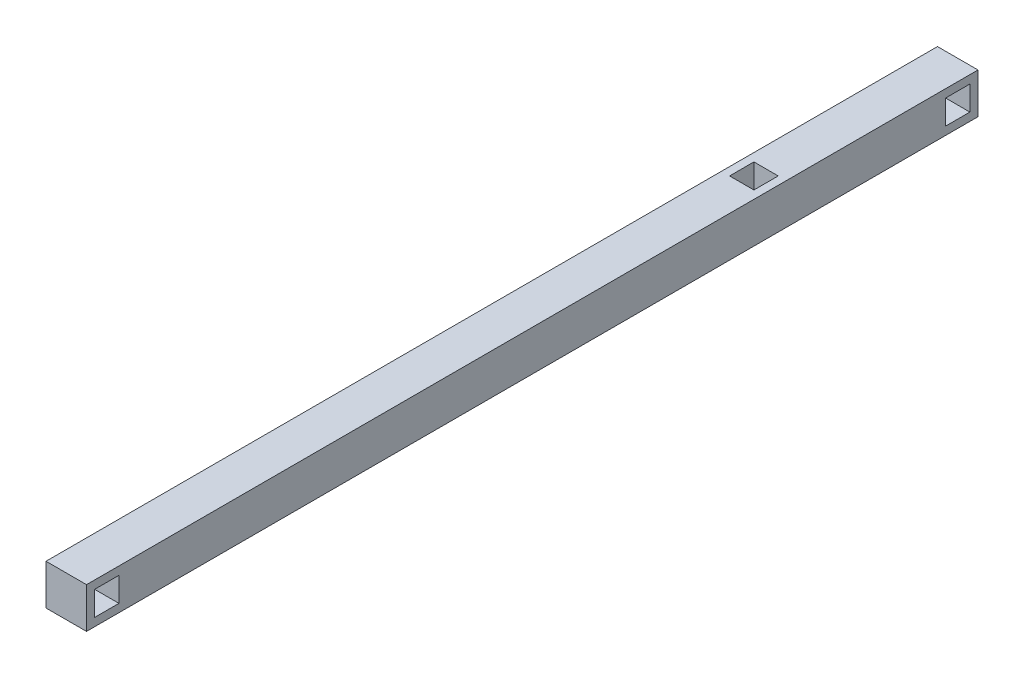
ISO-10303-21;
HEADER;
FILE_DESCRIPTION(('STEP AP214'),'2;1');
FILE_NAME('part.step','',(''),(''),'','','');
FILE_SCHEMA(('AUTOMOTIVE_DESIGN { 1 0 10303 214 1 1 1 1 }'));
ENDSEC;
DATA;
#1=APPLICATION_CONTEXT('core data for automotive mechanical design processes');
#2=APPLICATION_PROTOCOL_DEFINITION('international standard','automotive_design',2000,#1);
#3=PRODUCT_CONTEXT('',#1,'mechanical');
#4=PRODUCT('Part','Part','',(#3));
#5=PRODUCT_RELATED_PRODUCT_CATEGORY('part','',(#4));
#6=PRODUCT_DEFINITION_FORMATION('','',#4);
#7=PRODUCT_DEFINITION_CONTEXT('part definition',#1,'design');
#8=PRODUCT_DEFINITION('design','',#6,#7);
#9=PRODUCT_DEFINITION_SHAPE('','',#8);
#10=(LENGTH_UNIT() NAMED_UNIT(*) SI_UNIT(.MILLI.,.METRE.));
#11=(NAMED_UNIT(*) PLANE_ANGLE_UNIT() SI_UNIT($,.RADIAN.));
#12=(NAMED_UNIT(*) SI_UNIT($,.STERADIAN.) SOLID_ANGLE_UNIT());
#13=UNCERTAINTY_MEASURE_WITH_UNIT(LENGTH_MEASURE(1.E-05),#10,'distance_accuracy_value','');
#14=(GEOMETRIC_REPRESENTATION_CONTEXT(3) GLOBAL_UNCERTAINTY_ASSIGNED_CONTEXT((#13)) GLOBAL_UNIT_ASSIGNED_CONTEXT((#10,
#11,#12)) REPRESENTATION_CONTEXT('',''));
#15=CARTESIAN_POINT('',(0.,0.,0.));
#16=DIRECTION('',(0.,0.,1.));
#17=DIRECTION('',(1.,0.,0.));
#18=AXIS2_PLACEMENT_3D('',#15,#16,#17);
#19=CARTESIAN_POINT('',(0.,0.,110.));
#20=DIRECTION('',(1.,0.,0.));
#21=DIRECTION('',(0.,0.,-1.));
#22=AXIS2_PLACEMENT_3D('',#19,#20,#21);
#23=PLANE('',#22);
#24=DIRECTION('',(0.,0.,1.));
#25=VECTOR('',#24,1.);
#26=CARTESIAN_POINT('',(0.,1.,1.));
#27=LINE('',#26,#25);
#28=CARTESIAN_POINT('',(0.,1.,1.));
#29=VERTEX_POINT('',#28);
#30=CARTESIAN_POINT('',(0.,1.,4.));
#31=VERTEX_POINT('',#30);
#32=EDGE_CURVE('E184',#29,#31,#27,.T.);
#33=ORIENTED_EDGE('',*,*,#32,.F.);
#34=DIRECTION('',(0.,-1.,0.));
#35=VECTOR('',#34,1.);
#36=CARTESIAN_POINT('',(0.,1.,1.));
#37=LINE('',#36,#35);
#38=CARTESIAN_POINT('',(0.,4.,1.));
#39=VERTEX_POINT('',#38);
#40=EDGE_CURVE('E182',#39,#29,#37,.T.);
#41=ORIENTED_EDGE('',*,*,#40,.F.);
#42=DIRECTION('',(0.,0.,-1.));
#43=VECTOR('',#42,1.);
#44=CARTESIAN_POINT('',(0.,4.,1.));
#45=LINE('',#44,#43);
#46=CARTESIAN_POINT('',(0.,4.,4.));
#47=VERTEX_POINT('',#46);
#48=EDGE_CURVE('E191',#47,#39,#45,.T.);
#49=ORIENTED_EDGE('',*,*,#48,.F.);
#50=DIRECTION('',(0.,1.,0.));
#51=VECTOR('',#50,1.);
#52=CARTESIAN_POINT('',(0.,1.,4.));
#53=LINE('',#52,#51);
#54=EDGE_CURVE('E188',#31,#47,#53,.T.);
#55=ORIENTED_EDGE('',*,*,#54,.F.);
#56=EDGE_LOOP('',(#33,#41,#49,#55));
#57=FACE_BOUND('',#56,.T.);
#58=DIRECTION('',(0.,0.,-1.));
#59=VECTOR('',#58,1.);
#60=CARTESIAN_POINT('',(0.,4.,109.));
#61=LINE('',#60,#59);
#62=CARTESIAN_POINT('',(0.,4.,109.));
#63=VERTEX_POINT('',#62);
#64=CARTESIAN_POINT('',(0.,4.,106.));
#65=VERTEX_POINT('',#64);
#66=EDGE_CURVE('E205',#63,#65,#61,.T.);
#67=ORIENTED_EDGE('',*,*,#66,.F.);
#68=DIRECTION('',(0.,1.,0.));
#69=VECTOR('',#68,1.);
#70=CARTESIAN_POINT('',(0.,4.,109.));
#71=LINE('',#70,#69);
#72=CARTESIAN_POINT('',(0.,1.,109.));
#73=VERTEX_POINT('',#72);
#74=EDGE_CURVE('E181',#73,#63,#71,.T.);
#75=ORIENTED_EDGE('',*,*,#74,.F.);
#76=DIRECTION('',(0.,0.,1.));
#77=VECTOR('',#76,1.);
#78=CARTESIAN_POINT('',(0.,1.,109.));
#79=LINE('',#78,#77);
#80=CARTESIAN_POINT('',(0.,1.,106.));
#81=VERTEX_POINT('',#80);
#82=EDGE_CURVE('E211',#81,#73,#79,.T.);
#83=ORIENTED_EDGE('',*,*,#82,.F.);
#84=DIRECTION('',(0.,-1.,0.));
#85=VECTOR('',#84,1.);
#86=CARTESIAN_POINT('',(0.,4.,106.));
#87=LINE('',#86,#85);
#88=EDGE_CURVE('E208',#65,#81,#87,.T.);
#89=ORIENTED_EDGE('',*,*,#88,.F.);
#90=EDGE_LOOP('',(#67,#75,#83,#89));
#91=FACE_BOUND('',#90,.T.);
#92=DIRECTION('',(0.,-1.,0.));
#93=VECTOR('',#92,1.);
#94=CARTESIAN_POINT('',(0.,0.,0.));
#95=LINE('',#94,#93);
#96=CARTESIAN_POINT('',(0.,5.,0.));
#97=VERTEX_POINT('',#96);
#98=CARTESIAN_POINT('',(0.,0.,0.));
#99=VERTEX_POINT('',#98);
#100=EDGE_CURVE('E197',#97,#99,#95,.T.);
#101=ORIENTED_EDGE('',*,*,#100,.T.);
#102=DIRECTION('',(0.,0.,-1.));
#103=VECTOR('',#102,1.);
#104=CARTESIAN_POINT('',(0.,0.,110.));
#105=LINE('',#104,#103);
#106=CARTESIAN_POINT('',(0.,0.,110.));
#107=VERTEX_POINT('',#106);
#108=EDGE_CURVE('E248',#107,#99,#105,.T.);
#109=ORIENTED_EDGE('',*,*,#108,.F.);
#110=DIRECTION('',(0.,-1.,0.));
#111=VECTOR('',#110,1.);
#112=CARTESIAN_POINT('',(0.,0.,110.));
#113=LINE('',#112,#111);
#114=CARTESIAN_POINT('',(0.,5.,110.));
#115=VERTEX_POINT('',#114);
#116=EDGE_CURVE('E222',#115,#107,#113,.T.);
#117=ORIENTED_EDGE('',*,*,#116,.F.);
#118=DIRECTION('',(0.,0.,-1.));
#119=VECTOR('',#118,1.);
#120=CARTESIAN_POINT('',(0.,5.,110.));
#121=LINE('',#120,#119);
#122=EDGE_CURVE('E232',#115,#97,#121,.T.);
#123=ORIENTED_EDGE('',*,*,#122,.T.);
#124=EDGE_LOOP('',(#101,#109,#117,#123));
#125=FACE_BOUND('',#124,.T.);
#126=ADVANCED_FACE('F32',(#57,#91,#125),#23,.F.);
#127=CARTESIAN_POINT('',(0.,0.,110.));
#128=DIRECTION('',(0.,1.,0.));
#129=DIRECTION('',(0.,0.,1.));
#130=AXIS2_PLACEMENT_3D('',#127,#128,#129);
#131=PLANE('',#130);
#132=DIRECTION('',(-1.,0.,0.));
#133=VECTOR('',#132,1.);
#134=CARTESIAN_POINT('',(0.,0.,23.65));
#135=LINE('',#134,#133);
#136=CARTESIAN_POINT('',(4.,0.,23.65));
#137=VERTEX_POINT('',#136);
#138=CARTESIAN_POINT('',(0.999999999999999,0.,23.65));
#139=VERTEX_POINT('',#138);
#140=EDGE_CURVE('E175',#137,#139,#135,.T.);
#141=ORIENTED_EDGE('',*,*,#140,.T.);
#142=DIRECTION('',(0.,0.,1.));
#143=VECTOR('',#142,1.);
#144=CARTESIAN_POINT('',(1.00000000000001,0.,110.));
#145=LINE('',#144,#143);
#146=CARTESIAN_POINT('',(0.999999999999999,0.,26.65));
#147=VERTEX_POINT('',#146);
#148=EDGE_CURVE('E178',#139,#147,#145,.T.);
#149=ORIENTED_EDGE('',*,*,#148,.T.);
#150=DIRECTION('',(1.,0.,0.));
#151=VECTOR('',#150,1.);
#152=CARTESIAN_POINT('',(0.,0.,26.65));
#153=LINE('',#152,#151);
#154=CARTESIAN_POINT('',(4.,0.,26.65));
#155=VERTEX_POINT('',#154);
#156=EDGE_CURVE('E170',#147,#155,#153,.T.);
#157=ORIENTED_EDGE('',*,*,#156,.T.);
#158=DIRECTION('',(0.,0.,-1.));
#159=VECTOR('',#158,1.);
#160=CARTESIAN_POINT('',(4.00000000000005,0.,110.));
#161=LINE('',#160,#159);
#162=EDGE_CURVE('E150',#155,#137,#161,.T.);
#163=ORIENTED_EDGE('',*,*,#162,.T.);
#164=EDGE_LOOP('',(#141,#149,#157,#163));
#165=FACE_BOUND('',#164,.T.);
#166=DIRECTION('',(1.,0.,0.));
#167=VECTOR('',#166,1.);
#168=CARTESIAN_POINT('',(0.,0.,0.));
#169=LINE('',#168,#167);
#170=CARTESIAN_POINT('',(5.,0.,0.));
#171=VERTEX_POINT('',#170);
#172=EDGE_CURVE('E235',#99,#171,#169,.T.);
#173=ORIENTED_EDGE('',*,*,#172,.T.);
#174=DIRECTION('',(0.,0.,-1.));
#175=VECTOR('',#174,1.);
#176=CARTESIAN_POINT('',(5.,0.,110.));
#177=LINE('',#176,#175);
#178=CARTESIAN_POINT('',(5.,0.,110.));
#179=VERTEX_POINT('',#178);
#180=EDGE_CURVE('E245',#179,#171,#177,.T.);
#181=ORIENTED_EDGE('',*,*,#180,.F.);
#182=DIRECTION('',(1.,0.,0.));
#183=VECTOR('',#182,1.);
#184=CARTESIAN_POINT('',(0.,0.,110.));
#185=LINE('',#184,#183);
#186=EDGE_CURVE('E225',#107,#179,#185,.T.);
#187=ORIENTED_EDGE('',*,*,#186,.F.);
#188=ORIENTED_EDGE('',*,*,#108,.T.);
#189=EDGE_LOOP('',(#173,#181,#187,#188));
#190=FACE_BOUND('',#189,.T.);
#191=ADVANCED_FACE('F302',(#165,#190),#131,.F.);
#192=CARTESIAN_POINT('',(5.,0.,110.));
#193=DIRECTION('',(-1.,0.,0.));
#194=DIRECTION('',(0.,0.,1.));
#195=AXIS2_PLACEMENT_3D('',#192,#193,#194);
#196=PLANE('',#195);
#197=DIRECTION('',(0.,0.,-1.));
#198=VECTOR('',#197,1.);
#199=CARTESIAN_POINT('',(5.,4.,110.));
#200=LINE('',#199,#198);
#201=CARTESIAN_POINT('',(5.,4.,4.));
#202=VERTEX_POINT('',#201);
#203=CARTESIAN_POINT('',(5.,4.,1.));
#204=VERTEX_POINT('',#203);
#205=EDGE_CURVE('E39',#202,#204,#200,.T.);
#206=ORIENTED_EDGE('',*,*,#205,.T.);
#207=DIRECTION('',(0.,-1.,0.));
#208=VECTOR('',#207,1.);
#209=CARTESIAN_POINT('',(5.,0.,1.));
#210=LINE('',#209,#208);
#211=CARTESIAN_POINT('',(5.,1.,1.));
#212=VERTEX_POINT('',#211);
#213=EDGE_CURVE('E11',#204,#212,#210,.T.);
#214=ORIENTED_EDGE('',*,*,#213,.T.);
#215=DIRECTION('',(0.,0.,1.));
#216=VECTOR('',#215,1.);
#217=CARTESIAN_POINT('',(5.,1.,110.));
#218=LINE('',#217,#216);
#219=CARTESIAN_POINT('',(5.,1.,4.));
#220=VERTEX_POINT('',#219);
#221=EDGE_CURVE('E263',#212,#220,#218,.T.);
#222=ORIENTED_EDGE('',*,*,#221,.T.);
#223=DIRECTION('',(0.,1.,0.));
#224=VECTOR('',#223,1.);
#225=CARTESIAN_POINT('',(5.,0.,4.));
#226=LINE('',#225,#224);
#227=EDGE_CURVE('E266',#220,#202,#226,.T.);
#228=ORIENTED_EDGE('',*,*,#227,.T.);
#229=EDGE_LOOP('',(#206,#214,#222,#228));
#230=FACE_BOUND('',#229,.T.);
#231=DIRECTION('',(0.,0.,1.));
#232=VECTOR('',#231,1.);
#233=CARTESIAN_POINT('',(5.,1.,110.));
#234=LINE('',#233,#232);
#235=CARTESIAN_POINT('',(5.,1.,106.));
#236=VERTEX_POINT('',#235);
#237=CARTESIAN_POINT('',(5.,1.,109.));
#238=VERTEX_POINT('',#237);
#239=EDGE_CURVE('E257',#236,#238,#234,.T.);
#240=ORIENTED_EDGE('',*,*,#239,.T.);
#241=DIRECTION('',(0.,1.,0.));
#242=VECTOR('',#241,1.);
#243=CARTESIAN_POINT('',(5.,0.,109.));
#244=LINE('',#243,#242);
#245=CARTESIAN_POINT('',(5.,4.,109.));
#246=VERTEX_POINT('',#245);
#247=EDGE_CURVE('E260',#238,#246,#244,.T.);
#248=ORIENTED_EDGE('',*,*,#247,.T.);
#249=DIRECTION('',(0.,0.,-1.));
#250=VECTOR('',#249,1.);
#251=CARTESIAN_POINT('',(5.,4.,110.));
#252=LINE('',#251,#250);
#253=CARTESIAN_POINT('',(5.,4.,106.));
#254=VERTEX_POINT('',#253);
#255=EDGE_CURVE('E251',#246,#254,#252,.T.);
#256=ORIENTED_EDGE('',*,*,#255,.T.);
#257=DIRECTION('',(0.,-1.,0.));
#258=VECTOR('',#257,1.);
#259=CARTESIAN_POINT('',(5.,0.,106.));
#260=LINE('',#259,#258);
#261=EDGE_CURVE('E254',#254,#236,#260,.T.);
#262=ORIENTED_EDGE('',*,*,#261,.T.);
#263=EDGE_LOOP('',(#240,#248,#256,#262));
#264=FACE_BOUND('',#263,.T.);
#265=DIRECTION('',(0.,1.,0.));
#266=VECTOR('',#265,1.);
#267=CARTESIAN_POINT('',(5.,0.,0.));
#268=LINE('',#267,#266);
#269=CARTESIAN_POINT('',(5.,5.,0.));
#270=VERTEX_POINT('',#269);
#271=EDGE_CURVE('E237',#171,#270,#268,.T.);
#272=ORIENTED_EDGE('',*,*,#271,.T.);
#273=DIRECTION('',(0.,0.,-1.));
#274=VECTOR('',#273,1.);
#275=CARTESIAN_POINT('',(5.,5.,110.));
#276=LINE('',#275,#274);
#277=CARTESIAN_POINT('',(5.,5.,110.));
#278=VERTEX_POINT('',#277);
#279=EDGE_CURVE('E242',#278,#270,#276,.T.);
#280=ORIENTED_EDGE('',*,*,#279,.F.);
#281=DIRECTION('',(0.,1.,0.));
#282=VECTOR('',#281,1.);
#283=CARTESIAN_POINT('',(5.,0.,110.));
#284=LINE('',#283,#282);
#285=EDGE_CURVE('E228',#179,#278,#284,.T.);
#286=ORIENTED_EDGE('',*,*,#285,.F.);
#287=ORIENTED_EDGE('',*,*,#180,.T.);
#288=EDGE_LOOP('',(#272,#280,#286,#287));
#289=FACE_BOUND('',#288,.T.);
#290=ADVANCED_FACE('F270',(#230,#264,#289),#196,.F.);
#291=CARTESIAN_POINT('',(0.,5.,110.));
#292=DIRECTION('',(0.,-1.,0.));
#293=DIRECTION('',(0.,0.,-1.));
#294=AXIS2_PLACEMENT_3D('',#291,#292,#293);
#295=PLANE('',#294);
#296=DIRECTION('',(1.,0.,0.));
#297=VECTOR('',#296,1.);
#298=CARTESIAN_POINT('',(0.999999999999999,5.,26.65));
#299=LINE('',#298,#297);
#300=CARTESIAN_POINT('',(0.999999999999999,5.,26.65));
#301=VERTEX_POINT('',#300);
#302=CARTESIAN_POINT('',(4.,5.,26.65));
#303=VERTEX_POINT('',#302);
#304=EDGE_CURVE('E156',#301,#303,#299,.T.);
#305=ORIENTED_EDGE('',*,*,#304,.F.);
#306=DIRECTION('',(0.,0.,1.));
#307=VECTOR('',#306,1.);
#308=CARTESIAN_POINT('',(0.999999999999999,5.,23.65));
#309=LINE('',#308,#307);
#310=CARTESIAN_POINT('',(0.999999999999999,5.,23.65));
#311=VERTEX_POINT('',#310);
#312=EDGE_CURVE('E54',#311,#301,#309,.T.);
#313=ORIENTED_EDGE('',*,*,#312,.F.);
#314=DIRECTION('',(-1.,0.,0.));
#315=VECTOR('',#314,1.);
#316=CARTESIAN_POINT('',(0.999999999999999,5.,23.65));
#317=LINE('',#316,#315);
#318=CARTESIAN_POINT('',(4.,5.,23.65));
#319=VERTEX_POINT('',#318);
#320=EDGE_CURVE('E163',#319,#311,#317,.T.);
#321=ORIENTED_EDGE('',*,*,#320,.F.);
#322=DIRECTION('',(0.,0.,-1.));
#323=VECTOR('',#322,1.);
#324=CARTESIAN_POINT('',(4.,5.,23.65));
#325=LINE('',#324,#323);
#326=EDGE_CURVE('E147',#303,#319,#325,.T.);
#327=ORIENTED_EDGE('',*,*,#326,.F.);
#328=EDGE_LOOP('',(#305,#313,#321,#327));
#329=FACE_BOUND('',#328,.T.);
#330=DIRECTION('',(-1.,0.,0.));
#331=VECTOR('',#330,1.);
#332=CARTESIAN_POINT('',(0.,5.,0.));
#333=LINE('',#332,#331);
#334=EDGE_CURVE('E226',#270,#97,#333,.T.);
#335=ORIENTED_EDGE('',*,*,#334,.T.);
#336=ORIENTED_EDGE('',*,*,#122,.F.);
#337=DIRECTION('',(-1.,0.,0.));
#338=VECTOR('',#337,1.);
#339=CARTESIAN_POINT('',(0.,5.,110.));
#340=LINE('',#339,#338);
#341=EDGE_CURVE('E230',#278,#115,#340,.T.);
#342=ORIENTED_EDGE('',*,*,#341,.F.);
#343=ORIENTED_EDGE('',*,*,#279,.T.);
#344=EDGE_LOOP('',(#335,#336,#342,#343));
#345=FACE_BOUND('',#344,.T.);
#346=ADVANCED_FACE('F160',(#329,#345),#295,.F.);
#347=CARTESIAN_POINT('',(0.,0.,110.));
#348=DIRECTION('',(0.,0.,-1.));
#349=DIRECTION('',(-1.,0.,0.));
#350=AXIS2_PLACEMENT_3D('',#347,#348,#349);
#351=PLANE('',#350);
#352=ORIENTED_EDGE('',*,*,#116,.T.);
#353=ORIENTED_EDGE('',*,*,#186,.T.);
#354=ORIENTED_EDGE('',*,*,#285,.T.);
#355=ORIENTED_EDGE('',*,*,#341,.T.);
#356=EDGE_LOOP('',(#352,#353,#354,#355));
#357=FACE_BOUND('',#356,.T.);
#358=ADVANCED_FACE('F316',(#357),#351,.F.);
#359=CARTESIAN_POINT('',(0.,0.,0.));
#360=DIRECTION('',(0.,0.,-1.));
#361=DIRECTION('',(-1.,0.,0.));
#362=AXIS2_PLACEMENT_3D('',#359,#360,#361);
#363=PLANE('',#362);
#364=ORIENTED_EDGE('',*,*,#100,.F.);
#365=ORIENTED_EDGE('',*,*,#334,.F.);
#366=ORIENTED_EDGE('',*,*,#271,.F.);
#367=ORIENTED_EDGE('',*,*,#172,.F.);
#368=EDGE_LOOP('',(#364,#365,#366,#367));
#369=FACE_BOUND('',#368,.T.);
#370=ADVANCED_FACE('F317',(#369),#363,.T.);
#371=CARTESIAN_POINT('',(8.99999999999995,4.,109.));
#372=DIRECTION('',(0.,0.,1.));
#373=DIRECTION('',(1.,0.,0.));
#374=AXIS2_PLACEMENT_3D('',#371,#372,#373);
#375=PLANE('',#374);
#376=DIRECTION('',(-1.,0.,0.));
#377=VECTOR('',#376,1.);
#378=CARTESIAN_POINT('',(8.99999999999995,1.,109.));
#379=LINE('',#378,#377);
#380=EDGE_CURVE('E185',#238,#73,#379,.T.);
#381=ORIENTED_EDGE('',*,*,#380,.T.);
#382=ORIENTED_EDGE('',*,*,#74,.T.);
#383=DIRECTION('',(-1.,0.,0.));
#384=VECTOR('',#383,1.);
#385=CARTESIAN_POINT('',(8.99999999999995,4.,109.));
#386=LINE('',#385,#384);
#387=EDGE_CURVE('E214',#246,#63,#386,.T.);
#388=ORIENTED_EDGE('',*,*,#387,.F.);
#389=ORIENTED_EDGE('',*,*,#247,.F.);
#390=EDGE_LOOP('',(#381,#382,#388,#389));
#391=FACE_BOUND('',#390,.T.);
#392=ADVANCED_FACE('F320',(#391),#375,.F.);
#393=CARTESIAN_POINT('',(8.99999999999995,1.,109.));
#394=DIRECTION('',(0.,-1.,0.));
#395=DIRECTION('',(0.,0.,-1.));
#396=AXIS2_PLACEMENT_3D('',#393,#394,#395);
#397=PLANE('',#396);
#398=DIRECTION('',(-1.,0.,0.));
#399=VECTOR('',#398,1.);
#400=CARTESIAN_POINT('',(8.99999999999995,1.,106.));
#401=LINE('',#400,#399);
#402=EDGE_CURVE('E216',#236,#81,#401,.T.);
#403=ORIENTED_EDGE('',*,*,#402,.T.);
#404=ORIENTED_EDGE('',*,*,#82,.T.);
#405=ORIENTED_EDGE('',*,*,#380,.F.);
#406=ORIENTED_EDGE('',*,*,#239,.F.);
#407=EDGE_LOOP('',(#403,#404,#405,#406));
#408=FACE_BOUND('',#407,.T.);
#409=ADVANCED_FACE('F327',(#408),#397,.F.);
#410=CARTESIAN_POINT('',(8.99999999999995,4.,106.));
#411=DIRECTION('',(0.,0.,-1.));
#412=DIRECTION('',(-1.,0.,0.));
#413=AXIS2_PLACEMENT_3D('',#410,#411,#412);
#414=PLANE('',#413);
#415=DIRECTION('',(-1.,0.,0.));
#416=VECTOR('',#415,1.);
#417=CARTESIAN_POINT('',(8.99999999999995,4.,106.));
#418=LINE('',#417,#416);
#419=EDGE_CURVE('E218',#254,#65,#418,.T.);
#420=ORIENTED_EDGE('',*,*,#419,.T.);
#421=ORIENTED_EDGE('',*,*,#88,.T.);
#422=ORIENTED_EDGE('',*,*,#402,.F.);
#423=ORIENTED_EDGE('',*,*,#261,.F.);
#424=EDGE_LOOP('',(#420,#421,#422,#423));
#425=FACE_BOUND('',#424,.T.);
#426=ADVANCED_FACE('F332',(#425),#414,.F.);
#427=CARTESIAN_POINT('',(8.99999999999995,4.,109.));
#428=DIRECTION('',(0.,1.,0.));
#429=DIRECTION('',(0.,0.,1.));
#430=AXIS2_PLACEMENT_3D('',#427,#428,#429);
#431=PLANE('',#430);
#432=ORIENTED_EDGE('',*,*,#387,.T.);
#433=ORIENTED_EDGE('',*,*,#66,.T.);
#434=ORIENTED_EDGE('',*,*,#419,.F.);
#435=ORIENTED_EDGE('',*,*,#255,.F.);
#436=EDGE_LOOP('',(#432,#433,#434,#435));
#437=FACE_BOUND('',#436,.T.);
#438=ADVANCED_FACE('F329',(#437),#431,.F.);
#439=CARTESIAN_POINT('',(8.99999999999995,1.,1.));
#440=DIRECTION('',(0.,0.,-1.));
#441=DIRECTION('',(-1.,0.,0.));
#442=AXIS2_PLACEMENT_3D('',#439,#440,#441);
#443=PLANE('',#442);
#444=DIRECTION('',(-1.,0.,0.));
#445=VECTOR('',#444,1.);
#446=CARTESIAN_POINT('',(8.99999999999995,4.,1.));
#447=LINE('',#446,#445);
#448=EDGE_CURVE('E195',#204,#39,#447,.T.);
#449=ORIENTED_EDGE('',*,*,#448,.T.);
#450=ORIENTED_EDGE('',*,*,#40,.T.);
#451=DIRECTION('',(-1.,0.,0.));
#452=VECTOR('',#451,1.);
#453=CARTESIAN_POINT('',(8.99999999999995,1.,1.));
#454=LINE('',#453,#452);
#455=EDGE_CURVE('E194',#212,#29,#454,.T.);
#456=ORIENTED_EDGE('',*,*,#455,.F.);
#457=ORIENTED_EDGE('',*,*,#213,.F.);
#458=EDGE_LOOP('',(#449,#450,#456,#457));
#459=FACE_BOUND('',#458,.T.);
#460=ADVANCED_FACE('F287',(#459),#443,.F.);
#461=CARTESIAN_POINT('',(8.99999999999995,4.,1.));
#462=DIRECTION('',(0.,1.,0.));
#463=DIRECTION('',(0.,0.,1.));
#464=AXIS2_PLACEMENT_3D('',#461,#462,#463);
#465=PLANE('',#464);
#466=DIRECTION('',(-1.,0.,0.));
#467=VECTOR('',#466,1.);
#468=CARTESIAN_POINT('',(8.99999999999995,4.,4.));
#469=LINE('',#468,#467);
#470=EDGE_CURVE('E198',#202,#47,#469,.T.);
#471=ORIENTED_EDGE('',*,*,#470,.T.);
#472=ORIENTED_EDGE('',*,*,#48,.T.);
#473=ORIENTED_EDGE('',*,*,#448,.F.);
#474=ORIENTED_EDGE('',*,*,#205,.F.);
#475=EDGE_LOOP('',(#471,#472,#473,#474));
#476=FACE_BOUND('',#475,.T.);
#477=ADVANCED_FACE('F276',(#476),#465,.F.);
#478=CARTESIAN_POINT('',(8.99999999999995,1.,4.));
#479=DIRECTION('',(0.,0.,1.));
#480=DIRECTION('',(1.,0.,0.));
#481=AXIS2_PLACEMENT_3D('',#478,#479,#480);
#482=PLANE('',#481);
#483=DIRECTION('',(-1.,0.,0.));
#484=VECTOR('',#483,1.);
#485=CARTESIAN_POINT('',(8.99999999999995,1.,4.));
#486=LINE('',#485,#484);
#487=EDGE_CURVE('E200',#220,#31,#486,.T.);
#488=ORIENTED_EDGE('',*,*,#487,.T.);
#489=ORIENTED_EDGE('',*,*,#54,.T.);
#490=ORIENTED_EDGE('',*,*,#470,.F.);
#491=ORIENTED_EDGE('',*,*,#227,.F.);
#492=EDGE_LOOP('',(#488,#489,#490,#491));
#493=FACE_BOUND('',#492,.T.);
#494=ADVANCED_FACE('F278',(#493),#482,.F.);
#495=CARTESIAN_POINT('',(8.99999999999995,1.,1.));
#496=DIRECTION('',(0.,-1.,0.));
#497=DIRECTION('',(0.,0.,-1.));
#498=AXIS2_PLACEMENT_3D('',#495,#496,#497);
#499=PLANE('',#498);
#500=ORIENTED_EDGE('',*,*,#455,.T.);
#501=ORIENTED_EDGE('',*,*,#32,.T.);
#502=ORIENTED_EDGE('',*,*,#487,.F.);
#503=ORIENTED_EDGE('',*,*,#221,.F.);
#504=EDGE_LOOP('',(#500,#501,#502,#503));
#505=FACE_BOUND('',#504,.T.);
#506=ADVANCED_FACE('F289',(#505),#499,.F.);
#507=CARTESIAN_POINT('',(0.999999999999999,-3.99999999999995,23.65));
#508=DIRECTION('',(-1.,0.,0.));
#509=DIRECTION('',(0.,0.,1.));
#510=AXIS2_PLACEMENT_3D('',#507,#508,#509);
#511=PLANE('',#510);
#512=DIRECTION('',(0.,1.,0.));
#513=VECTOR('',#512,1.);
#514=CARTESIAN_POINT('',(0.999999999999999,-3.99999999999995,23.65));
#515=LINE('',#514,#513);
#516=EDGE_CURVE('E168',#139,#311,#515,.T.);
#517=ORIENTED_EDGE('',*,*,#516,.T.);
#518=ORIENTED_EDGE('',*,*,#312,.T.);
#519=DIRECTION('',(0.,1.,0.));
#520=VECTOR('',#519,1.);
#521=CARTESIAN_POINT('',(0.999999999999999,-3.99999999999995,26.65));
#522=LINE('',#521,#520);
#523=EDGE_CURVE('E153',#147,#301,#522,.T.);
#524=ORIENTED_EDGE('',*,*,#523,.F.);
#525=ORIENTED_EDGE('',*,*,#148,.F.);
#526=EDGE_LOOP('',(#517,#518,#524,#525));
#527=FACE_BOUND('',#526,.T.);
#528=ADVANCED_FACE('F291',(#527),#511,.F.);
#529=CARTESIAN_POINT('',(0.999999999999999,-3.99999999999995,23.65));
#530=DIRECTION('',(0.,0.,-1.));
#531=DIRECTION('',(-1.,0.,0.));
#532=AXIS2_PLACEMENT_3D('',#529,#530,#531);
#533=PLANE('',#532);
#534=DIRECTION('',(0.,1.,0.));
#535=VECTOR('',#534,1.);
#536=CARTESIAN_POINT('',(4.,-3.99999999999995,23.65));
#537=LINE('',#536,#535);
#538=EDGE_CURVE('E152',#137,#319,#537,.T.);
#539=ORIENTED_EDGE('',*,*,#538,.T.);
#540=ORIENTED_EDGE('',*,*,#320,.T.);
#541=ORIENTED_EDGE('',*,*,#516,.F.);
#542=ORIENTED_EDGE('',*,*,#140,.F.);
#543=EDGE_LOOP('',(#539,#540,#541,#542));
#544=FACE_BOUND('',#543,.T.);
#545=ADVANCED_FACE('F297',(#544),#533,.F.);
#546=CARTESIAN_POINT('',(4.,-3.99999999999995,23.65));
#547=DIRECTION('',(1.,0.,0.));
#548=DIRECTION('',(0.,0.,-1.));
#549=AXIS2_PLACEMENT_3D('',#546,#547,#548);
#550=PLANE('',#549);
#551=DIRECTION('',(0.,1.,0.));
#552=VECTOR('',#551,1.);
#553=CARTESIAN_POINT('',(4.,-3.99999999999995,26.65));
#554=LINE('',#553,#552);
#555=EDGE_CURVE('E46',#155,#303,#554,.T.);
#556=ORIENTED_EDGE('',*,*,#555,.T.);
#557=ORIENTED_EDGE('',*,*,#326,.T.);
#558=ORIENTED_EDGE('',*,*,#538,.F.);
#559=ORIENTED_EDGE('',*,*,#162,.F.);
#560=EDGE_LOOP('',(#556,#557,#558,#559));
#561=FACE_BOUND('',#560,.T.);
#562=ADVANCED_FACE('F144',(#561),#550,.F.);
#563=CARTESIAN_POINT('',(0.999999999999999,-3.99999999999995,26.65));
#564=DIRECTION('',(0.,0.,1.));
#565=DIRECTION('',(1.,0.,0.));
#566=AXIS2_PLACEMENT_3D('',#563,#564,#565);
#567=PLANE('',#566);
#568=ORIENTED_EDGE('',*,*,#523,.T.);
#569=ORIENTED_EDGE('',*,*,#304,.T.);
#570=ORIENTED_EDGE('',*,*,#555,.F.);
#571=ORIENTED_EDGE('',*,*,#156,.F.);
#572=EDGE_LOOP('',(#568,#569,#570,#571));
#573=FACE_BOUND('',#572,.T.);
#574=ADVANCED_FACE('F157',(#573),#567,.F.);
#575=CLOSED_SHELL('',(#126,#191,#290,#346,#358,#370,#392,#409,#426,#438,#460,#477,#494,#506,
#528,#545,#562,#574));
#576=MANIFOLD_SOLID_BREP('B2',#575);
#577=ADVANCED_BREP_SHAPE_REPRESENTATION('',(#18,#576),#14);
#578=SHAPE_DEFINITION_REPRESENTATION(#9,#577);
ENDSEC;
END-ISO-10303-21;
